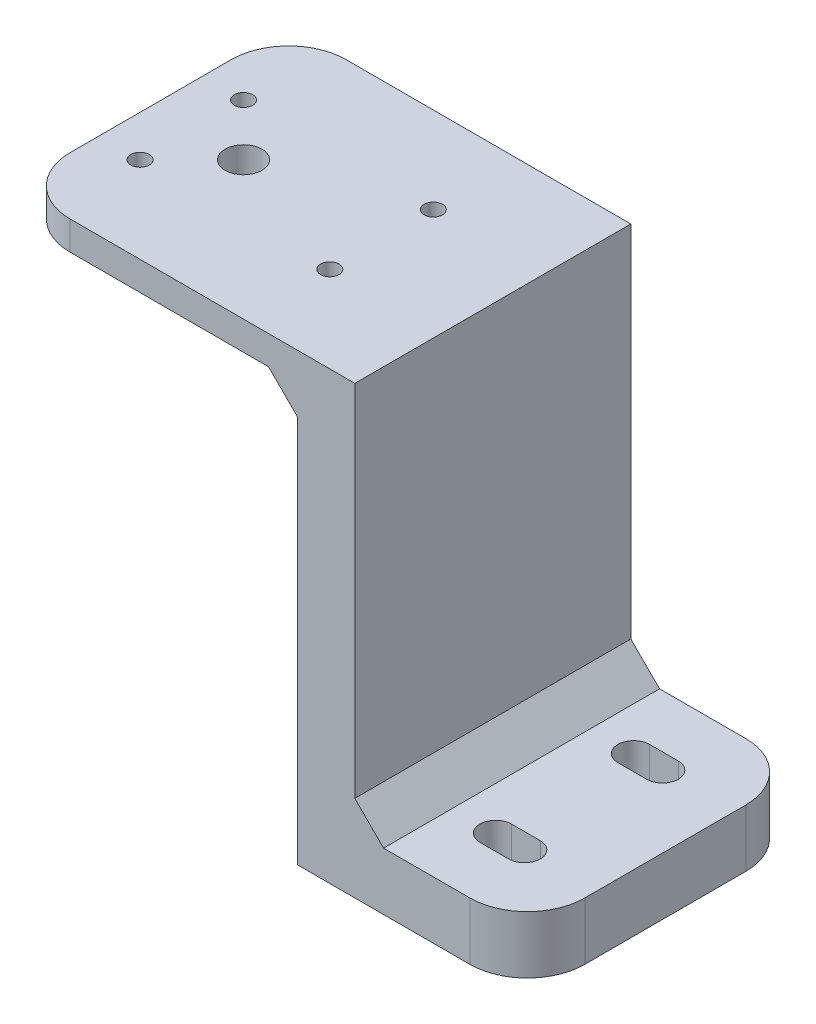
ISO-10303-21;
HEADER;
FILE_DESCRIPTION(('STEP AP214'),'2;1');
FILE_NAME('part.step','',(''),(''),'','','');
FILE_SCHEMA(('AUTOMOTIVE_DESIGN { 1 0 10303 214 1 1 1 1 }'));
ENDSEC;
DATA;
#1=APPLICATION_CONTEXT('core data for automotive mechanical design processes');
#2=APPLICATION_PROTOCOL_DEFINITION('international standard','automotive_design',2000,#1);
#3=PRODUCT_CONTEXT('',#1,'mechanical');
#4=PRODUCT('Part','Part','',(#3));
#5=PRODUCT_RELATED_PRODUCT_CATEGORY('part','',(#4));
#6=PRODUCT_DEFINITION_FORMATION('','',#4);
#7=PRODUCT_DEFINITION_CONTEXT('part definition',#1,'design');
#8=PRODUCT_DEFINITION('design','',#6,#7);
#9=PRODUCT_DEFINITION_SHAPE('','',#8);
#10=(LENGTH_UNIT() NAMED_UNIT(*) SI_UNIT(.MILLI.,.METRE.));
#11=(NAMED_UNIT(*) PLANE_ANGLE_UNIT() SI_UNIT($,.RADIAN.));
#12=(NAMED_UNIT(*) SI_UNIT($,.STERADIAN.) SOLID_ANGLE_UNIT());
#13=UNCERTAINTY_MEASURE_WITH_UNIT(LENGTH_MEASURE(1.E-05),#10,'distance_accuracy_value','');
#14=(GEOMETRIC_REPRESENTATION_CONTEXT(3) GLOBAL_UNCERTAINTY_ASSIGNED_CONTEXT((#13)) GLOBAL_UNIT_ASSIGNED_CONTEXT((#10,
#11,#12)) REPRESENTATION_CONTEXT('',''));
#15=CARTESIAN_POINT('',(0.,0.,0.));
#16=DIRECTION('',(0.,0.,1.));
#17=DIRECTION('',(1.,0.,0.));
#18=AXIS2_PLACEMENT_3D('',#15,#16,#17);
#19=CARTESIAN_POINT('',(35.5,5.,-24.));
#20=DIRECTION('',(-1.,0.,0.));
#21=DIRECTION('',(0.,0.,1.));
#22=AXIS2_PLACEMENT_3D('',#19,#20,#21);
#23=PLANE('',#22);
#24=DIRECTION('',(0.,-1.,0.));
#25=VECTOR('',#24,1.);
#26=CARTESIAN_POINT('',(35.5,5.,24.));
#27=LINE('',#26,#25);
#28=CARTESIAN_POINT('',(35.5,5.,24.));
#29=VERTEX_POINT('',#28);
#30=CARTESIAN_POINT('',(35.5,-57.5,24.));
#31=VERTEX_POINT('',#30);
#32=EDGE_CURVE('E496',#29,#31,#27,.T.);
#33=ORIENTED_EDGE('',*,*,#32,.T.);
#34=DIRECTION('',(0.,0.,-1.));
#35=VECTOR('',#34,1.);
#36=CARTESIAN_POINT('',(35.5,-57.5,-24.));
#37=LINE('',#36,#35);
#38=CARTESIAN_POINT('',(35.5,-57.5,-24.));
#39=VERTEX_POINT('',#38);
#40=EDGE_CURVE('E557',#31,#39,#37,.T.);
#41=ORIENTED_EDGE('',*,*,#40,.T.);
#42=DIRECTION('',(0.,-1.,0.));
#43=VECTOR('',#42,1.);
#44=CARTESIAN_POINT('',(35.5,5.,-24.));
#45=LINE('',#44,#43);
#46=CARTESIAN_POINT('',(35.5,5.,-24.));
#47=VERTEX_POINT('',#46);
#48=EDGE_CURVE('E484',#47,#39,#45,.T.);
#49=ORIENTED_EDGE('',*,*,#48,.F.);
#50=DIRECTION('',(0.,0.,-1.));
#51=VECTOR('',#50,1.);
#52=CARTESIAN_POINT('',(35.5,5.,-24.));
#53=LINE('',#52,#51);
#54=EDGE_CURVE('E477',#29,#47,#53,.T.);
#55=ORIENTED_EDGE('',*,*,#54,.F.);
#56=EDGE_LOOP('',(#33,#41,#49,#55));
#57=FACE_BOUND('',#56,.T.);
#58=ADVANCED_FACE('F194',(#57),#23,.F.);
#59=CARTESIAN_POINT('',(0.,0.,0.));
#60=DIRECTION('',(0.,1.,0.));
#61=DIRECTION('',(0.,0.,1.));
#62=AXIS2_PLACEMENT_3D('',#59,#60,#61);
#63=PLANE('',#62);
#64=CARTESIAN_POINT('',(-7.84999999999999,0.,0.));
#65=DIRECTION('',(0.,1.,0.));
#66=DIRECTION('',(0.,0.,1.));
#67=AXIS2_PLACEMENT_3D('',#64,#65,#66);
#68=CIRCLE('',#67,3.19999999999999);
#69=CARTESIAN_POINT('',(-7.84999999999999,0.,3.19999999999999));
#70=VERTEX_POINT('',#69);
#71=EDGE_CURVE('E778',#70,#70,#68,.T.);
#72=ORIENTED_EDGE('',*,*,#71,.T.);
#73=EDGE_LOOP('',(#72));
#74=FACE_BOUND('',#73,.T.);
#75=CARTESIAN_POINT('',(-16.85,0.,9.00000000000001));
#76=DIRECTION('',(0.,1.,0.));
#77=DIRECTION('',(0.,0.,1.));
#78=AXIS2_PLACEMENT_3D('',#75,#76,#77);
#79=CIRCLE('',#78,1.59999999999999);
#80=CARTESIAN_POINT('',(-16.85,0.,10.6));
#81=VERTEX_POINT('',#80);
#82=EDGE_CURVE('E783',#81,#81,#79,.T.);
#83=ORIENTED_EDGE('',*,*,#82,.T.);
#84=EDGE_LOOP('',(#83));
#85=FACE_BOUND('',#84,.T.);
#86=CARTESIAN_POINT('',(-16.85,0.,-8.99999999999999));
#87=DIRECTION('',(0.,1.,0.));
#88=DIRECTION('',(0.,0.,1.));
#89=AXIS2_PLACEMENT_3D('',#86,#87,#88);
#90=CIRCLE('',#89,1.59999999999999);
#91=CARTESIAN_POINT('',(-16.85,0.,-7.4));
#92=VERTEX_POINT('',#91);
#93=EDGE_CURVE('E792',#92,#92,#90,.T.);
#94=ORIENTED_EDGE('',*,*,#93,.T.);
#95=EDGE_LOOP('',(#94));
#96=FACE_BOUND('',#95,.T.);
#97=CARTESIAN_POINT('',(16.15,0.,-8.99999999999999));
#98=DIRECTION('',(0.,1.,0.));
#99=DIRECTION('',(0.,0.,1.));
#100=AXIS2_PLACEMENT_3D('',#97,#98,#99);
#101=CIRCLE('',#100,1.59999999999999);
#102=CARTESIAN_POINT('',(16.15,0.,-7.4));
#103=VERTEX_POINT('',#102);
#104=EDGE_CURVE('E712',#103,#103,#101,.T.);
#105=ORIENTED_EDGE('',*,*,#104,.T.);
#106=EDGE_LOOP('',(#105));
#107=FACE_BOUND('',#106,.T.);
#108=CARTESIAN_POINT('',(16.15,0.,9.00000000000001));
#109=DIRECTION('',(0.,1.,0.));
#110=DIRECTION('',(0.,0.,1.));
#111=AXIS2_PLACEMENT_3D('',#108,#109,#110);
#112=CIRCLE('',#111,1.59999999999999);
#113=CARTESIAN_POINT('',(16.15,0.,10.6));
#114=VERTEX_POINT('',#113);
#115=EDGE_CURVE('E711',#114,#114,#112,.T.);
#116=ORIENTED_EDGE('',*,*,#115,.T.);
#117=EDGE_LOOP('',(#116));
#118=FACE_BOUND('',#117,.T.);
#119=DIRECTION('',(-1.,0.,0.));
#120=VECTOR('',#119,1.);
#121=CARTESIAN_POINT('',(-24.,0.,-24.));
#122=LINE('',#121,#120);
#123=CARTESIAN_POINT('',(20.5,0.,-24.));
#124=VERTEX_POINT('',#123);
#125=CARTESIAN_POINT('',(-14.,0.,-24.));
#126=VERTEX_POINT('',#125);
#127=EDGE_CURVE('E474',#124,#126,#122,.T.);
#128=ORIENTED_EDGE('',*,*,#127,.F.);
#129=DIRECTION('',(0.,0.,1.));
#130=VECTOR('',#129,1.);
#131=CARTESIAN_POINT('',(20.5,0.,24.));
#132=LINE('',#131,#130);
#133=CARTESIAN_POINT('',(20.5,0.,24.));
#134=VERTEX_POINT('',#133);
#135=EDGE_CURVE('E211',#124,#134,#132,.T.);
#136=ORIENTED_EDGE('',*,*,#135,.T.);
#137=DIRECTION('',(1.,0.,0.));
#138=VECTOR('',#137,1.);
#139=CARTESIAN_POINT('',(-24.,0.,24.));
#140=LINE('',#139,#138);
#141=CARTESIAN_POINT('',(-14.,0.,24.));
#142=VERTEX_POINT('',#141);
#143=EDGE_CURVE('E488',#142,#134,#140,.T.);
#144=ORIENTED_EDGE('',*,*,#143,.F.);
#145=CARTESIAN_POINT('',(-14.,0.,14.));
#146=DIRECTION('',(0.,1.,0.));
#147=DIRECTION('',(0.,0.,1.));
#148=AXIS2_PLACEMENT_3D('',#145,#146,#147);
#149=CIRCLE('',#148,10.);
#150=CARTESIAN_POINT('',(-24.,0.,14.));
#151=VERTEX_POINT('',#150);
#152=EDGE_CURVE('E507',#142,#151,#149,.F.);
#153=ORIENTED_EDGE('',*,*,#152,.T.);
#154=DIRECTION('',(0.,0.,1.));
#155=VECTOR('',#154,1.);
#156=CARTESIAN_POINT('',(-24.,0.,-24.));
#157=LINE('',#156,#155);
#158=CARTESIAN_POINT('',(-24.,0.,-14.));
#159=VERTEX_POINT('',#158);
#160=EDGE_CURVE('E468',#159,#151,#157,.T.);
#161=ORIENTED_EDGE('',*,*,#160,.F.);
#162=CARTESIAN_POINT('',(-14.,0.,-14.));
#163=DIRECTION('',(0.,1.,0.));
#164=DIRECTION('',(0.,0.,1.));
#165=AXIS2_PLACEMENT_3D('',#162,#163,#164);
#166=CIRCLE('',#165,10.);
#167=EDGE_CURVE('E510',#159,#126,#166,.F.);
#168=ORIENTED_EDGE('',*,*,#167,.T.);
#169=EDGE_LOOP('',(#128,#136,#144,#153,#161,#168));
#170=FACE_BOUND('',#169,.T.);
#171=ADVANCED_FACE('F601',(#74,#85,#96,#107,#118,#170),#63,.F.);
#172=CARTESIAN_POINT('',(-24.,5.,-24.));
#173=DIRECTION('',(1.,0.,0.));
#174=DIRECTION('',(0.,0.,-1.));
#175=AXIS2_PLACEMENT_3D('',#172,#173,#174);
#176=PLANE('',#175);
#177=DIRECTION('',(0.,0.,1.));
#178=VECTOR('',#177,1.);
#179=CARTESIAN_POINT('',(-24.,5.,-24.));
#180=LINE('',#179,#178);
#181=CARTESIAN_POINT('',(-24.,5.,-14.));
#182=VERTEX_POINT('',#181);
#183=CARTESIAN_POINT('',(-24.,5.,14.));
#184=VERTEX_POINT('',#183);
#185=EDGE_CURVE('E469',#182,#184,#180,.T.);
#186=ORIENTED_EDGE('',*,*,#185,.F.);
#187=DIRECTION('',(0.,-1.,0.));
#188=VECTOR('',#187,1.);
#189=CARTESIAN_POINT('',(-24.,5.,-14.));
#190=LINE('',#189,#188);
#191=EDGE_CURVE('E503',#182,#159,#190,.T.);
#192=ORIENTED_EDGE('',*,*,#191,.T.);
#193=ORIENTED_EDGE('',*,*,#160,.T.);
#194=DIRECTION('',(0.,-1.,0.));
#195=VECTOR('',#194,1.);
#196=CARTESIAN_POINT('',(-24.,5.,14.));
#197=LINE('',#196,#195);
#198=EDGE_CURVE('E500',#151,#184,#197,.F.);
#199=ORIENTED_EDGE('',*,*,#198,.T.);
#200=EDGE_LOOP('',(#186,#192,#193,#199));
#201=FACE_BOUND('',#200,.T.);
#202=ADVANCED_FACE('F604',(#201),#176,.F.);
#203=CARTESIAN_POINT('',(-24.,5.,24.));
#204=DIRECTION('',(0.,0.,-1.));
#205=DIRECTION('',(-1.,0.,0.));
#206=AXIS2_PLACEMENT_3D('',#203,#204,#205);
#207=PLANE('',#206);
#208=DIRECTION('',(-1.,0.,0.));
#209=VECTOR('',#208,1.);
#210=CARTESIAN_POINT('',(35.5,-72.5,24.));
#211=LINE('',#210,#209);
#212=CARTESIAN_POINT('',(55.5,-72.5,24.));
#213=VERTEX_POINT('',#212);
#214=CARTESIAN_POINT('',(25.5,-72.5,24.));
#215=VERTEX_POINT('',#214);
#216=EDGE_CURVE('E451',#213,#215,#211,.T.);
#217=ORIENTED_EDGE('',*,*,#216,.F.);
#218=DIRECTION('',(0.,-1.,0.));
#219=VECTOR('',#218,1.);
#220=CARTESIAN_POINT('',(55.5,5.,24.));
#221=LINE('',#220,#219);
#222=CARTESIAN_POINT('',(55.5,-62.5,24.));
#223=VERTEX_POINT('',#222);
#224=EDGE_CURVE('E550',#213,#223,#221,.F.);
#225=ORIENTED_EDGE('',*,*,#224,.T.);
#226=DIRECTION('',(-1.,0.,0.));
#227=VECTOR('',#226,1.);
#228=CARTESIAN_POINT('',(65.5,-62.5,24.));
#229=LINE('',#228,#227);
#230=CARTESIAN_POINT('',(40.5000000000001,-62.5,24.));
#231=VERTEX_POINT('',#230);
#232=EDGE_CURVE('E443',#223,#231,#229,.T.);
#233=ORIENTED_EDGE('',*,*,#232,.T.);
#234=DIRECTION('',(0.707106781186552,-0.707106781186543,0.));
#235=VECTOR('',#234,1.);
#236=CARTESIAN_POINT('',(-25.5000000000004,3.49999999999958,24.));
#237=LINE('',#236,#235);
#238=EDGE_CURVE('E566',#231,#31,#237,.F.);
#239=ORIENTED_EDGE('',*,*,#238,.T.);
#240=ORIENTED_EDGE('',*,*,#32,.F.);
#241=DIRECTION('',(1.,0.,0.));
#242=VECTOR('',#241,1.);
#243=CARTESIAN_POINT('',(-24.,5.,24.));
#244=LINE('',#243,#242);
#245=CARTESIAN_POINT('',(-14.,5.,24.));
#246=VERTEX_POINT('',#245);
#247=EDGE_CURVE('E473',#246,#29,#244,.T.);
#248=ORIENTED_EDGE('',*,*,#247,.F.);
#249=DIRECTION('',(0.,-1.,0.));
#250=VECTOR('',#249,1.);
#251=CARTESIAN_POINT('',(-14.,5.,24.));
#252=LINE('',#251,#250);
#253=EDGE_CURVE('E523',#246,#142,#252,.T.);
#254=ORIENTED_EDGE('',*,*,#253,.T.);
#255=ORIENTED_EDGE('',*,*,#143,.T.);
#256=DIRECTION('',(-0.707106781186544,0.707106781186551,0.));
#257=VECTOR('',#256,1.);
#258=CARTESIAN_POINT('',(-4.24999999999976,24.75,24.));
#259=LINE('',#258,#257);
#260=CARTESIAN_POINT('',(25.5,-5.00000000000007,24.));
#261=VERTEX_POINT('',#260);
#262=EDGE_CURVE('E13',#134,#261,#259,.F.);
#263=ORIENTED_EDGE('',*,*,#262,.T.);
#264=DIRECTION('',(0.,1.,0.));
#265=VECTOR('',#264,1.);
#266=CARTESIAN_POINT('',(25.5,-72.5,24.));
#267=LINE('',#266,#265);
#268=EDGE_CURVE('E464',#215,#261,#267,.T.);
#269=ORIENTED_EDGE('',*,*,#268,.F.);
#270=EDGE_LOOP('',(#217,#225,#233,#239,#240,#248,#254,#255,#263,#269));
#271=FACE_BOUND('',#270,.T.);
#272=ADVANCED_FACE('F588',(#271),#207,.F.);
#273=CARTESIAN_POINT('',(-24.,5.,-24.));
#274=DIRECTION('',(0.,0.,1.));
#275=DIRECTION('',(1.,0.,0.));
#276=AXIS2_PLACEMENT_3D('',#273,#274,#275);
#277=PLANE('',#276);
#278=DIRECTION('',(-1.,0.,0.));
#279=VECTOR('',#278,1.);
#280=CARTESIAN_POINT('',(65.5,-62.5,-24.));
#281=LINE('',#280,#279);
#282=CARTESIAN_POINT('',(55.5,-62.5,-24.));
#283=VERTEX_POINT('',#282);
#284=CARTESIAN_POINT('',(40.5000000000001,-62.5,-24.));
#285=VERTEX_POINT('',#284);
#286=EDGE_CURVE('E447',#283,#285,#281,.T.);
#287=ORIENTED_EDGE('',*,*,#286,.F.);
#288=DIRECTION('',(0.,1.,0.));
#289=VECTOR('',#288,1.);
#290=CARTESIAN_POINT('',(55.5,5.,-24.));
#291=LINE('',#290,#289);
#292=CARTESIAN_POINT('',(55.5,-72.5,-24.));
#293=VERTEX_POINT('',#292);
#294=EDGE_CURVE('E541',#283,#293,#291,.F.);
#295=ORIENTED_EDGE('',*,*,#294,.T.);
#296=DIRECTION('',(1.,0.,0.));
#297=VECTOR('',#296,1.);
#298=CARTESIAN_POINT('',(35.5,-72.5,-24.));
#299=LINE('',#298,#297);
#300=CARTESIAN_POINT('',(25.5,-72.5,-24.));
#301=VERTEX_POINT('',#300);
#302=EDGE_CURVE('E457',#301,#293,#299,.T.);
#303=ORIENTED_EDGE('',*,*,#302,.F.);
#304=DIRECTION('',(0.,1.,0.));
#305=VECTOR('',#304,1.);
#306=CARTESIAN_POINT('',(25.5,-72.5,-24.));
#307=LINE('',#306,#305);
#308=CARTESIAN_POINT('',(25.5,-5.00000000000007,-24.));
#309=VERTEX_POINT('',#308);
#310=EDGE_CURVE('E461',#301,#309,#307,.T.);
#311=ORIENTED_EDGE('',*,*,#310,.T.);
#312=DIRECTION('',(0.707106781186544,-0.707106781186551,0.));
#313=VECTOR('',#312,1.);
#314=CARTESIAN_POINT('',(-4.24999999999976,24.75,-24.));
#315=LINE('',#314,#313);
#316=EDGE_CURVE('E204',#309,#124,#315,.F.);
#317=ORIENTED_EDGE('',*,*,#316,.T.);
#318=ORIENTED_EDGE('',*,*,#127,.T.);
#319=DIRECTION('',(0.,-1.,0.));
#320=VECTOR('',#319,1.);
#321=CARTESIAN_POINT('',(-14.,5.,-24.));
#322=LINE('',#321,#320);
#323=CARTESIAN_POINT('',(-14.,5.,-24.));
#324=VERTEX_POINT('',#323);
#325=EDGE_CURVE('E514',#126,#324,#322,.F.);
#326=ORIENTED_EDGE('',*,*,#325,.T.);
#327=DIRECTION('',(-1.,0.,0.));
#328=VECTOR('',#327,1.);
#329=CARTESIAN_POINT('',(-24.,5.,-24.));
#330=LINE('',#329,#328);
#331=EDGE_CURVE('E480',#47,#324,#330,.T.);
#332=ORIENTED_EDGE('',*,*,#331,.F.);
#333=ORIENTED_EDGE('',*,*,#48,.T.);
#334=DIRECTION('',(-0.707106781186552,0.707106781186543,0.));
#335=VECTOR('',#334,1.);
#336=CARTESIAN_POINT('',(-25.5000000000004,3.49999999999957,-24.));
#337=LINE('',#336,#335);
#338=EDGE_CURVE('E569',#39,#285,#337,.F.);
#339=ORIENTED_EDGE('',*,*,#338,.T.);
#340=EDGE_LOOP('',(#287,#295,#303,#311,#317,#318,#326,#332,#333,#339));
#341=FACE_BOUND('',#340,.T.);
#342=ADVANCED_FACE('F574',(#341),#277,.F.);
#343=CARTESIAN_POINT('',(0.,5.,0.));
#344=DIRECTION('',(0.,1.,0.));
#345=DIRECTION('',(0.,0.,1.));
#346=AXIS2_PLACEMENT_3D('',#343,#344,#345);
#347=PLANE('',#346);
#348=CARTESIAN_POINT('',(-7.84999999999999,5.,0.));
#349=DIRECTION('',(0.,1.,0.));
#350=DIRECTION('',(0.,0.,1.));
#351=AXIS2_PLACEMENT_3D('',#348,#349,#350);
#352=CIRCLE('',#351,3.2);
#353=CARTESIAN_POINT('',(-7.84999999999999,5.,3.2));
#354=VERTEX_POINT('',#353);
#355=EDGE_CURVE('E693',#354,#354,#352,.T.);
#356=ORIENTED_EDGE('',*,*,#355,.F.);
#357=EDGE_LOOP('',(#356));
#358=FACE_BOUND('',#357,.T.);
#359=CARTESIAN_POINT('',(-16.85,5.,9.00000000000001));
#360=DIRECTION('',(0.,1.,0.));
#361=DIRECTION('',(0.,0.,1.));
#362=AXIS2_PLACEMENT_3D('',#359,#360,#361);
#363=CIRCLE('',#362,1.6);
#364=CARTESIAN_POINT('',(-16.85,5.,10.6));
#365=VERTEX_POINT('',#364);
#366=EDGE_CURVE('E697',#365,#365,#363,.T.);
#367=ORIENTED_EDGE('',*,*,#366,.F.);
#368=EDGE_LOOP('',(#367));
#369=FACE_BOUND('',#368,.T.);
#370=CARTESIAN_POINT('',(-16.85,5.,-8.99999999999999));
#371=DIRECTION('',(0.,1.,0.));
#372=DIRECTION('',(0.,0.,1.));
#373=AXIS2_PLACEMENT_3D('',#370,#371,#372);
#374=CIRCLE('',#373,1.6);
#375=CARTESIAN_POINT('',(-16.85,5.,-7.4));
#376=VERTEX_POINT('',#375);
#377=EDGE_CURVE('E701',#376,#376,#374,.T.);
#378=ORIENTED_EDGE('',*,*,#377,.F.);
#379=EDGE_LOOP('',(#378));
#380=FACE_BOUND('',#379,.T.);
#381=CARTESIAN_POINT('',(16.15,5.,-8.99999999999999));
#382=DIRECTION('',(0.,1.,0.));
#383=DIRECTION('',(0.,0.,1.));
#384=AXIS2_PLACEMENT_3D('',#381,#382,#383);
#385=CIRCLE('',#384,1.6);
#386=CARTESIAN_POINT('',(16.15,5.,-7.4));
#387=VERTEX_POINT('',#386);
#388=EDGE_CURVE('E705',#387,#387,#385,.T.);
#389=ORIENTED_EDGE('',*,*,#388,.F.);
#390=EDGE_LOOP('',(#389));
#391=FACE_BOUND('',#390,.T.);
#392=CARTESIAN_POINT('',(16.15,5.,9.00000000000001));
#393=DIRECTION('',(0.,1.,0.));
#394=DIRECTION('',(0.,0.,1.));
#395=AXIS2_PLACEMENT_3D('',#392,#393,#394);
#396=CIRCLE('',#395,1.6);
#397=CARTESIAN_POINT('',(16.15,5.,10.6));
#398=VERTEX_POINT('',#397);
#399=EDGE_CURVE('E708',#398,#398,#396,.T.);
#400=ORIENTED_EDGE('',*,*,#399,.F.);
#401=EDGE_LOOP('',(#400));
#402=FACE_BOUND('',#401,.T.);
#403=ORIENTED_EDGE('',*,*,#331,.T.);
#404=CARTESIAN_POINT('',(-14.,5.,-14.));
#405=DIRECTION('',(0.,1.,0.));
#406=DIRECTION('',(0.,0.,1.));
#407=AXIS2_PLACEMENT_3D('',#404,#405,#406);
#408=CIRCLE('',#407,10.);
#409=EDGE_CURVE('E520',#324,#182,#408,.T.);
#410=ORIENTED_EDGE('',*,*,#409,.T.);
#411=ORIENTED_EDGE('',*,*,#185,.T.);
#412=CARTESIAN_POINT('',(-14.,5.,14.));
#413=DIRECTION('',(0.,1.,0.));
#414=DIRECTION('',(0.,0.,1.));
#415=AXIS2_PLACEMENT_3D('',#412,#413,#414);
#416=CIRCLE('',#415,10.);
#417=EDGE_CURVE('E517',#184,#246,#416,.T.);
#418=ORIENTED_EDGE('',*,*,#417,.T.);
#419=ORIENTED_EDGE('',*,*,#247,.T.);
#420=ORIENTED_EDGE('',*,*,#54,.T.);
#421=EDGE_LOOP('',(#403,#410,#411,#418,#419,#420));
#422=FACE_BOUND('',#421,.T.);
#423=ADVANCED_FACE('F593',(#358,#369,#380,#391,#402,#422),#347,.T.);
#424=CARTESIAN_POINT('',(25.5,-72.5,24.));
#425=DIRECTION('',(1.,0.,0.));
#426=DIRECTION('',(0.,0.,-1.));
#427=AXIS2_PLACEMENT_3D('',#424,#425,#426);
#428=PLANE('',#427);
#429=ORIENTED_EDGE('',*,*,#268,.T.);
#430=DIRECTION('',(0.,0.,-1.));
#431=VECTOR('',#430,1.);
#432=CARTESIAN_POINT('',(25.5,-5.00000000000007,-24.));
#433=LINE('',#432,#431);
#434=EDGE_CURVE('E560',#261,#309,#433,.T.);
#435=ORIENTED_EDGE('',*,*,#434,.T.);
#436=ORIENTED_EDGE('',*,*,#310,.F.);
#437=DIRECTION('',(0.,0.,-1.));
#438=VECTOR('',#437,1.);
#439=CARTESIAN_POINT('',(25.5,-72.5,24.));
#440=LINE('',#439,#438);
#441=EDGE_CURVE('E454',#215,#301,#440,.T.);
#442=ORIENTED_EDGE('',*,*,#441,.F.);
#443=EDGE_LOOP('',(#429,#435,#436,#442));
#444=FACE_BOUND('',#443,.T.);
#445=ADVANCED_FACE('F615',(#444),#428,.F.);
#446=CARTESIAN_POINT('',(0.,-72.5,0.));
#447=DIRECTION('',(0.,1.,0.));
#448=DIRECTION('',(0.,0.,1.));
#449=AXIS2_PLACEMENT_3D('',#446,#447,#448);
#450=PLANE('',#449);
#451=CARTESIAN_POINT('',(48.,-72.5,12.));
#452=DIRECTION('',(0.,1.,0.));
#453=DIRECTION('',(0.,0.,1.));
#454=AXIS2_PLACEMENT_3D('',#451,#452,#453);
#455=CIRCLE('',#454,2.75);
#456=CARTESIAN_POINT('',(48.,-72.5,9.24999999999999));
#457=VERTEX_POINT('',#456);
#458=CARTESIAN_POINT('',(48.,-72.5,14.75));
#459=VERTEX_POINT('',#458);
#460=EDGE_CURVE('E383',#457,#459,#455,.T.);
#461=ORIENTED_EDGE('',*,*,#460,.T.);
#462=DIRECTION('',(-1.,0.,0.));
#463=VECTOR('',#462,1.);
#464=CARTESIAN_POINT('',(53.,-72.5,14.75));
#465=LINE('',#464,#463);
#466=CARTESIAN_POINT('',(53.,-72.5,14.75));
#467=VERTEX_POINT('',#466);
#468=EDGE_CURVE('E356',#467,#459,#465,.T.);
#469=ORIENTED_EDGE('',*,*,#468,.F.);
#470=CARTESIAN_POINT('',(53.,-72.5,12.));
#471=DIRECTION('',(0.,1.,0.));
#472=DIRECTION('',(0.,0.,1.));
#473=AXIS2_PLACEMENT_3D('',#470,#471,#472);
#474=CIRCLE('',#473,2.75);
#475=CARTESIAN_POINT('',(53.,-72.5,9.24999999999998));
#476=VERTEX_POINT('',#475);
#477=EDGE_CURVE('E363',#467,#476,#474,.T.);
#478=ORIENTED_EDGE('',*,*,#477,.T.);
#479=DIRECTION('',(-1.,0.,0.));
#480=VECTOR('',#479,1.);
#481=CARTESIAN_POINT('',(53.,-72.5,9.24999999999999));
#482=LINE('',#481,#480);
#483=EDGE_CURVE('E724',#476,#457,#482,.T.);
#484=ORIENTED_EDGE('',*,*,#483,.T.);
#485=EDGE_LOOP('',(#461,#469,#478,#484));
#486=FACE_BOUND('',#485,.T.);
#487=DIRECTION('',(-1.,0.,0.));
#488=VECTOR('',#487,1.);
#489=CARTESIAN_POINT('',(53.,-72.5,-14.75));
#490=LINE('',#489,#488);
#491=CARTESIAN_POINT('',(53.,-72.5,-14.75));
#492=VERTEX_POINT('',#491);
#493=CARTESIAN_POINT('',(48.,-72.5,-14.75));
#494=VERTEX_POINT('',#493);
#495=EDGE_CURVE('E395',#492,#494,#490,.T.);
#496=ORIENTED_EDGE('',*,*,#495,.T.);
#497=CARTESIAN_POINT('',(48.,-72.5,-12.));
#498=DIRECTION('',(0.,1.,0.));
#499=DIRECTION('',(0.,0.,1.));
#500=AXIS2_PLACEMENT_3D('',#497,#498,#499);
#501=CIRCLE('',#500,2.75);
#502=CARTESIAN_POINT('',(48.,-72.5,-9.25));
#503=VERTEX_POINT('',#502);
#504=EDGE_CURVE('E424',#494,#503,#501,.T.);
#505=ORIENTED_EDGE('',*,*,#504,.T.);
#506=DIRECTION('',(-1.,0.,0.));
#507=VECTOR('',#506,1.);
#508=CARTESIAN_POINT('',(53.,-72.5,-9.25000000000001));
#509=LINE('',#508,#507);
#510=CARTESIAN_POINT('',(53.,-72.5,-9.25000000000001));
#511=VERTEX_POINT('',#510);
#512=EDGE_CURVE('E399',#511,#503,#509,.T.);
#513=ORIENTED_EDGE('',*,*,#512,.F.);
#514=CARTESIAN_POINT('',(53.,-72.5,-12.));
#515=DIRECTION('',(0.,1.,0.));
#516=DIRECTION('',(0.,0.,1.));
#517=AXIS2_PLACEMENT_3D('',#514,#515,#516);
#518=CIRCLE('',#517,2.75);
#519=EDGE_CURVE('E409',#511,#492,#518,.T.);
#520=ORIENTED_EDGE('',*,*,#519,.T.);
#521=EDGE_LOOP('',(#496,#505,#513,#520));
#522=FACE_BOUND('',#521,.T.);
#523=ORIENTED_EDGE('',*,*,#302,.T.);
#524=CARTESIAN_POINT('',(55.5,-72.5,-14.));
#525=DIRECTION('',(0.,1.,0.));
#526=DIRECTION('',(0.,0.,1.));
#527=AXIS2_PLACEMENT_3D('',#524,#525,#526);
#528=CIRCLE('',#527,10.);
#529=CARTESIAN_POINT('',(65.5,-72.5,-14.));
#530=VERTEX_POINT('',#529);
#531=EDGE_CURVE('E547',#293,#530,#528,.F.);
#532=ORIENTED_EDGE('',*,*,#531,.T.);
#533=DIRECTION('',(0.,0.,-1.));
#534=VECTOR('',#533,1.);
#535=CARTESIAN_POINT('',(65.5,-72.5,24.));
#536=LINE('',#535,#534);
#537=CARTESIAN_POINT('',(65.5,-72.5,14.));
#538=VERTEX_POINT('',#537);
#539=EDGE_CURVE('E435',#538,#530,#536,.T.);
#540=ORIENTED_EDGE('',*,*,#539,.F.);
#541=CARTESIAN_POINT('',(55.5,-72.5,14.));
#542=DIRECTION('',(0.,1.,0.));
#543=DIRECTION('',(0.,0.,1.));
#544=AXIS2_PLACEMENT_3D('',#541,#542,#543);
#545=CIRCLE('',#544,10.);
#546=EDGE_CURVE('E544',#538,#213,#545,.F.);
#547=ORIENTED_EDGE('',*,*,#546,.T.);
#548=ORIENTED_EDGE('',*,*,#216,.T.);
#549=ORIENTED_EDGE('',*,*,#441,.T.);
#550=EDGE_LOOP('',(#523,#532,#540,#547,#548,#549));
#551=FACE_BOUND('',#550,.T.);
#552=ADVANCED_FACE('F619',(#486,#522,#551),#450,.F.);
#553=CARTESIAN_POINT('',(65.5,-62.5,24.));
#554=DIRECTION('',(0.,-1.,0.));
#555=DIRECTION('',(0.,0.,-1.));
#556=AXIS2_PLACEMENT_3D('',#553,#554,#555);
#557=PLANE('',#556);
#558=CARTESIAN_POINT('',(53.,-62.5,12.));
#559=DIRECTION('',(0.,1.,0.));
#560=DIRECTION('',(0.,0.,1.));
#561=AXIS2_PLACEMENT_3D('',#558,#559,#560);
#562=CIRCLE('',#561,2.75);
#563=CARTESIAN_POINT('',(53.,-62.5,14.75));
#564=VERTEX_POINT('',#563);
#565=CARTESIAN_POINT('',(53.,-62.5,9.25000000000002));
#566=VERTEX_POINT('',#565);
#567=EDGE_CURVE('E355',#564,#566,#562,.T.);
#568=ORIENTED_EDGE('',*,*,#567,.F.);
#569=DIRECTION('',(-1.,0.,0.));
#570=VECTOR('',#569,1.);
#571=CARTESIAN_POINT('',(53.,-62.5,14.75));
#572=LINE('',#571,#570);
#573=CARTESIAN_POINT('',(48.,-62.5,14.75));
#574=VERTEX_POINT('',#573);
#575=EDGE_CURVE('E343',#564,#574,#572,.T.);
#576=ORIENTED_EDGE('',*,*,#575,.T.);
#577=CARTESIAN_POINT('',(48.,-62.5,12.));
#578=DIRECTION('',(0.,1.,0.));
#579=DIRECTION('',(0.,0.,1.));
#580=AXIS2_PLACEMENT_3D('',#577,#578,#579);
#581=CIRCLE('',#580,2.75);
#582=CARTESIAN_POINT('',(48.,-62.5,9.25000000000002));
#583=VERTEX_POINT('',#582);
#584=EDGE_CURVE('E366',#583,#574,#581,.T.);
#585=ORIENTED_EDGE('',*,*,#584,.F.);
#586=DIRECTION('',(-1.,0.,0.));
#587=VECTOR('',#586,1.);
#588=CARTESIAN_POINT('',(53.,-62.5,9.25000000000002));
#589=LINE('',#588,#587);
#590=EDGE_CURVE('E372',#566,#583,#589,.T.);
#591=ORIENTED_EDGE('',*,*,#590,.F.);
#592=EDGE_LOOP('',(#568,#576,#585,#591));
#593=FACE_BOUND('',#592,.T.);
#594=CARTESIAN_POINT('',(53.,-62.5,-12.));
#595=DIRECTION('',(0.,1.,0.));
#596=DIRECTION('',(0.,0.,1.));
#597=AXIS2_PLACEMENT_3D('',#594,#595,#596);
#598=CIRCLE('',#597,2.75);
#599=CARTESIAN_POINT('',(53.,-62.5,-9.25));
#600=VERTEX_POINT('',#599);
#601=CARTESIAN_POINT('',(53.,-62.5,-14.75));
#602=VERTEX_POINT('',#601);
#603=EDGE_CURVE('E406',#600,#602,#598,.T.);
#604=ORIENTED_EDGE('',*,*,#603,.F.);
#605=DIRECTION('',(-1.,0.,0.));
#606=VECTOR('',#605,1.);
#607=CARTESIAN_POINT('',(53.,-62.5,-9.25));
#608=LINE('',#607,#606);
#609=CARTESIAN_POINT('',(48.,-62.5,-9.24999999999999));
#610=VERTEX_POINT('',#609);
#611=EDGE_CURVE('E402',#600,#610,#608,.T.);
#612=ORIENTED_EDGE('',*,*,#611,.T.);
#613=CARTESIAN_POINT('',(48.,-62.5,-12.));
#614=DIRECTION('',(0.,1.,0.));
#615=DIRECTION('',(0.,0.,1.));
#616=AXIS2_PLACEMENT_3D('',#613,#614,#615);
#617=CIRCLE('',#616,2.75);
#618=CARTESIAN_POINT('',(48.,-62.5,-14.75));
#619=VERTEX_POINT('',#618);
#620=EDGE_CURVE('E420',#619,#610,#617,.T.);
#621=ORIENTED_EDGE('',*,*,#620,.F.);
#622=DIRECTION('',(-1.,0.,0.));
#623=VECTOR('',#622,1.);
#624=CARTESIAN_POINT('',(53.,-62.5,-14.75));
#625=LINE('',#624,#623);
#626=EDGE_CURVE('E392',#602,#619,#625,.T.);
#627=ORIENTED_EDGE('',*,*,#626,.F.);
#628=EDGE_LOOP('',(#604,#612,#621,#627));
#629=FACE_BOUND('',#628,.T.);
#630=ORIENTED_EDGE('',*,*,#286,.T.);
#631=DIRECTION('',(0.,0.,1.));
#632=VECTOR('',#631,1.);
#633=CARTESIAN_POINT('',(40.5000000000001,-62.5,24.));
#634=LINE('',#633,#632);
#635=EDGE_CURVE('E553',#285,#231,#634,.T.);
#636=ORIENTED_EDGE('',*,*,#635,.T.);
#637=ORIENTED_EDGE('',*,*,#232,.F.);
#638=CARTESIAN_POINT('',(55.5,-62.5,14.));
#639=DIRECTION('',(0.,-1.,0.));
#640=DIRECTION('',(0.,0.,-1.));
#641=AXIS2_PLACEMENT_3D('',#638,#639,#640);
#642=CIRCLE('',#641,10.);
#643=CARTESIAN_POINT('',(65.5,-62.5,14.));
#644=VERTEX_POINT('',#643);
#645=EDGE_CURVE('E535',#223,#644,#642,.F.);
#646=ORIENTED_EDGE('',*,*,#645,.T.);
#647=DIRECTION('',(0.,0.,1.));
#648=VECTOR('',#647,1.);
#649=CARTESIAN_POINT('',(65.5,-62.5,24.));
#650=LINE('',#649,#648);
#651=CARTESIAN_POINT('',(65.5,-62.5,-14.));
#652=VERTEX_POINT('',#651);
#653=EDGE_CURVE('E439',#652,#644,#650,.T.);
#654=ORIENTED_EDGE('',*,*,#653,.F.);
#655=CARTESIAN_POINT('',(55.5,-62.5,-14.));
#656=DIRECTION('',(0.,-1.,0.));
#657=DIRECTION('',(0.,0.,-1.));
#658=AXIS2_PLACEMENT_3D('',#655,#656,#657);
#659=CIRCLE('',#658,10.);
#660=EDGE_CURVE('E538',#652,#283,#659,.F.);
#661=ORIENTED_EDGE('',*,*,#660,.T.);
#662=EDGE_LOOP('',(#630,#636,#637,#646,#654,#661));
#663=FACE_BOUND('',#662,.T.);
#664=ADVANCED_FACE('F369',(#593,#629,#663),#557,.F.);
#665=CARTESIAN_POINT('',(65.5,0.,0.));
#666=DIRECTION('',(-1.,0.,0.));
#667=DIRECTION('',(0.,0.,1.));
#668=AXIS2_PLACEMENT_3D('',#665,#666,#667);
#669=PLANE('',#668);
#670=ORIENTED_EDGE('',*,*,#539,.T.);
#671=DIRECTION('',(0.,1.,0.));
#672=VECTOR('',#671,1.);
#673=CARTESIAN_POINT('',(65.5,0.,-14.));
#674=LINE('',#673,#672);
#675=EDGE_CURVE('E531',#530,#652,#674,.T.);
#676=ORIENTED_EDGE('',*,*,#675,.T.);
#677=ORIENTED_EDGE('',*,*,#653,.T.);
#678=DIRECTION('',(0.,-1.,0.));
#679=VECTOR('',#678,1.);
#680=CARTESIAN_POINT('',(65.5,0.,14.));
#681=LINE('',#680,#679);
#682=EDGE_CURVE('E527',#644,#538,#681,.T.);
#683=ORIENTED_EDGE('',*,*,#682,.T.);
#684=EDGE_LOOP('',(#670,#676,#677,#683));
#685=FACE_BOUND('',#684,.T.);
#686=ADVANCED_FACE('F628',(#685),#669,.F.);
#687=CARTESIAN_POINT('',(-14.,5.,-14.));
#688=DIRECTION('',(0.,-1.,0.));
#689=DIRECTION('',(0.,0.,-1.));
#690=AXIS2_PLACEMENT_3D('',#687,#688,#689);
#691=CYLINDRICAL_SURFACE('',#690,10.);
#692=ORIENTED_EDGE('',*,*,#409,.F.);
#693=ORIENTED_EDGE('',*,*,#325,.F.);
#694=ORIENTED_EDGE('',*,*,#167,.F.);
#695=ORIENTED_EDGE('',*,*,#191,.F.);
#696=EDGE_LOOP('',(#692,#693,#694,#695));
#697=FACE_BOUND('',#696,.T.);
#698=ADVANCED_FACE('F607',(#697),#691,.T.);
#699=CARTESIAN_POINT('',(-14.,5.,14.));
#700=DIRECTION('',(0.,-1.,0.));
#701=DIRECTION('',(0.,0.,-1.));
#702=AXIS2_PLACEMENT_3D('',#699,#700,#701);
#703=CYLINDRICAL_SURFACE('',#702,10.);
#704=ORIENTED_EDGE('',*,*,#417,.F.);
#705=ORIENTED_EDGE('',*,*,#198,.F.);
#706=ORIENTED_EDGE('',*,*,#152,.F.);
#707=ORIENTED_EDGE('',*,*,#253,.F.);
#708=EDGE_LOOP('',(#704,#705,#706,#707));
#709=FACE_BOUND('',#708,.T.);
#710=ADVANCED_FACE('F598',(#709),#703,.T.);
#711=CARTESIAN_POINT('',(48.,-62.5,-12.));
#712=DIRECTION('',(0.,1.,0.));
#713=DIRECTION('',(0.,0.,1.));
#714=AXIS2_PLACEMENT_3D('',#711,#712,#713);
#715=CYLINDRICAL_SURFACE('',#714,2.75);
#716=ORIENTED_EDGE('',*,*,#620,.T.);
#717=DIRECTION('',(0.,1.,0.));
#718=VECTOR('',#717,1.);
#719=CARTESIAN_POINT('',(48.,-62.5,-9.25));
#720=LINE('',#719,#718);
#721=EDGE_CURVE('E428',#503,#610,#720,.T.);
#722=ORIENTED_EDGE('',*,*,#721,.F.);
#723=ORIENTED_EDGE('',*,*,#504,.F.);
#724=DIRECTION('',(0.,1.,0.));
#725=VECTOR('',#724,1.);
#726=CARTESIAN_POINT('',(48.,-62.5,-14.75));
#727=LINE('',#726,#725);
#728=EDGE_CURVE('E431',#619,#494,#727,.F.);
#729=ORIENTED_EDGE('',*,*,#728,.F.);
#730=EDGE_LOOP('',(#716,#722,#723,#729));
#731=FACE_BOUND('',#730,.T.);
#732=ADVANCED_FACE('F661',(#731),#715,.F.);
#733=CARTESIAN_POINT('',(53.,-62.5,-12.));
#734=DIRECTION('',(0.,1.,0.));
#735=DIRECTION('',(0.,0.,1.));
#736=AXIS2_PLACEMENT_3D('',#733,#734,#735);
#737=CYLINDRICAL_SURFACE('',#736,2.75);
#738=ORIENTED_EDGE('',*,*,#603,.T.);
#739=DIRECTION('',(0.,1.,0.));
#740=VECTOR('',#739,1.);
#741=CARTESIAN_POINT('',(53.,-62.5,-14.75));
#742=LINE('',#741,#740);
#743=EDGE_CURVE('E413',#492,#602,#742,.T.);
#744=ORIENTED_EDGE('',*,*,#743,.F.);
#745=ORIENTED_EDGE('',*,*,#519,.F.);
#746=DIRECTION('',(0.,1.,0.));
#747=VECTOR('',#746,1.);
#748=CARTESIAN_POINT('',(53.,-62.5,-9.25000000000001));
#749=LINE('',#748,#747);
#750=EDGE_CURVE('E417',#600,#511,#749,.F.);
#751=ORIENTED_EDGE('',*,*,#750,.F.);
#752=EDGE_LOOP('',(#738,#744,#745,#751));
#753=FACE_BOUND('',#752,.T.);
#754=ADVANCED_FACE('F665',(#753),#737,.F.);
#755=CARTESIAN_POINT('',(53.,-62.5,-9.25000000000001));
#756=DIRECTION('',(0.,0.,1.));
#757=DIRECTION('',(1.,0.,0.));
#758=AXIS2_PLACEMENT_3D('',#755,#756,#757);
#759=PLANE('',#758);
#760=ORIENTED_EDGE('',*,*,#721,.T.);
#761=ORIENTED_EDGE('',*,*,#611,.F.);
#762=ORIENTED_EDGE('',*,*,#750,.T.);
#763=ORIENTED_EDGE('',*,*,#512,.T.);
#764=EDGE_LOOP('',(#760,#761,#762,#763));
#765=FACE_BOUND('',#764,.T.);
#766=ADVANCED_FACE('F671',(#765),#759,.F.);
#767=CARTESIAN_POINT('',(53.,-62.5,-14.75));
#768=DIRECTION('',(0.,0.,-1.));
#769=DIRECTION('',(-1.,0.,0.));
#770=AXIS2_PLACEMENT_3D('',#767,#768,#769);
#771=PLANE('',#770);
#772=ORIENTED_EDGE('',*,*,#728,.T.);
#773=ORIENTED_EDGE('',*,*,#495,.F.);
#774=ORIENTED_EDGE('',*,*,#743,.T.);
#775=ORIENTED_EDGE('',*,*,#626,.T.);
#776=EDGE_LOOP('',(#772,#773,#774,#775));
#777=FACE_BOUND('',#776,.T.);
#778=ADVANCED_FACE('F737',(#777),#771,.F.);
#779=CARTESIAN_POINT('',(48.,-62.5,12.));
#780=DIRECTION('',(0.,1.,0.));
#781=DIRECTION('',(0.,0.,1.));
#782=AXIS2_PLACEMENT_3D('',#779,#780,#781);
#783=CYLINDRICAL_SURFACE('',#782,2.75);
#784=ORIENTED_EDGE('',*,*,#584,.T.);
#785=DIRECTION('',(0.,1.,0.));
#786=VECTOR('',#785,1.);
#787=CARTESIAN_POINT('',(48.,-62.5,14.75));
#788=LINE('',#787,#786);
#789=EDGE_CURVE('E349',#459,#574,#788,.T.);
#790=ORIENTED_EDGE('',*,*,#789,.F.);
#791=ORIENTED_EDGE('',*,*,#460,.F.);
#792=DIRECTION('',(0.,1.,0.));
#793=VECTOR('',#792,1.);
#794=CARTESIAN_POINT('',(48.,-62.5,9.24999999999999));
#795=LINE('',#794,#793);
#796=EDGE_CURVE('E389',#583,#457,#795,.F.);
#797=ORIENTED_EDGE('',*,*,#796,.F.);
#798=EDGE_LOOP('',(#784,#790,#791,#797));
#799=FACE_BOUND('',#798,.T.);
#800=ADVANCED_FACE('F730',(#799),#783,.F.);
#801=CARTESIAN_POINT('',(53.,-62.5,12.));
#802=DIRECTION('',(0.,1.,0.));
#803=DIRECTION('',(0.,0.,1.));
#804=AXIS2_PLACEMENT_3D('',#801,#802,#803);
#805=CYLINDRICAL_SURFACE('',#804,2.75);
#806=ORIENTED_EDGE('',*,*,#567,.T.);
#807=DIRECTION('',(0.,1.,0.));
#808=VECTOR('',#807,1.);
#809=CARTESIAN_POINT('',(53.,-62.5,9.24999999999998));
#810=LINE('',#809,#808);
#811=EDGE_CURVE('E367',#476,#566,#810,.T.);
#812=ORIENTED_EDGE('',*,*,#811,.F.);
#813=ORIENTED_EDGE('',*,*,#477,.F.);
#814=DIRECTION('',(0.,1.,0.));
#815=VECTOR('',#814,1.);
#816=CARTESIAN_POINT('',(53.,-62.5,14.75));
#817=LINE('',#816,#815);
#818=EDGE_CURVE('E346',#564,#467,#817,.F.);
#819=ORIENTED_EDGE('',*,*,#818,.F.);
#820=EDGE_LOOP('',(#806,#812,#813,#819));
#821=FACE_BOUND('',#820,.T.);
#822=ADVANCED_FACE('F360',(#821),#805,.F.);
#823=CARTESIAN_POINT('',(53.,-62.5,14.75));
#824=DIRECTION('',(0.,0.,1.));
#825=DIRECTION('',(1.,0.,0.));
#826=AXIS2_PLACEMENT_3D('',#823,#824,#825);
#827=PLANE('',#826);
#828=ORIENTED_EDGE('',*,*,#789,.T.);
#829=ORIENTED_EDGE('',*,*,#575,.F.);
#830=ORIENTED_EDGE('',*,*,#818,.T.);
#831=ORIENTED_EDGE('',*,*,#468,.T.);
#832=EDGE_LOOP('',(#828,#829,#830,#831));
#833=FACE_BOUND('',#832,.T.);
#834=ADVANCED_FACE('F345',(#833),#827,.F.);
#835=CARTESIAN_POINT('',(53.,-62.5,9.24999999999998));
#836=DIRECTION('',(0.,0.,-1.));
#837=DIRECTION('',(-1.,0.,0.));
#838=AXIS2_PLACEMENT_3D('',#835,#836,#837);
#839=PLANE('',#838);
#840=ORIENTED_EDGE('',*,*,#796,.T.);
#841=ORIENTED_EDGE('',*,*,#483,.F.);
#842=ORIENTED_EDGE('',*,*,#811,.T.);
#843=ORIENTED_EDGE('',*,*,#590,.T.);
#844=EDGE_LOOP('',(#840,#841,#842,#843));
#845=FACE_BOUND('',#844,.T.);
#846=ADVANCED_FACE('F633',(#845),#839,.F.);
#847=CARTESIAN_POINT('',(55.5,0.,-14.));
#848=DIRECTION('',(0.,1.,0.));
#849=DIRECTION('',(0.,0.,1.));
#850=AXIS2_PLACEMENT_3D('',#847,#848,#849);
#851=CYLINDRICAL_SURFACE('',#850,10.);
#852=ORIENTED_EDGE('',*,*,#531,.F.);
#853=ORIENTED_EDGE('',*,*,#294,.F.);
#854=ORIENTED_EDGE('',*,*,#660,.F.);
#855=ORIENTED_EDGE('',*,*,#675,.F.);
#856=EDGE_LOOP('',(#852,#853,#854,#855));
#857=FACE_BOUND('',#856,.T.);
#858=ADVANCED_FACE('F631',(#857),#851,.T.);
#859=CARTESIAN_POINT('',(55.5,0.,14.));
#860=DIRECTION('',(0.,-1.,0.));
#861=DIRECTION('',(0.,0.,-1.));
#862=AXIS2_PLACEMENT_3D('',#859,#860,#861);
#863=CYLINDRICAL_SURFACE('',#862,10.);
#864=ORIENTED_EDGE('',*,*,#645,.F.);
#865=ORIENTED_EDGE('',*,*,#224,.F.);
#866=ORIENTED_EDGE('',*,*,#546,.F.);
#867=ORIENTED_EDGE('',*,*,#682,.F.);
#868=EDGE_LOOP('',(#864,#865,#866,#867));
#869=FACE_BOUND('',#868,.T.);
#870=ADVANCED_FACE('F625',(#869),#863,.T.);
#871=CARTESIAN_POINT('',(16.15,5.,9.00000000000001));
#872=DIRECTION('',(0.,1.,0.));
#873=DIRECTION('',(0.,0.,1.));
#874=AXIS2_PLACEMENT_3D('',#871,#872,#873);
#875=CYLINDRICAL_SURFACE('',#874,1.59999999999999);
#876=ORIENTED_EDGE('',*,*,#399,.T.);
#877=EDGE_LOOP('',(#876));
#878=FACE_BOUND('',#877,.T.);
#879=ORIENTED_EDGE('',*,*,#115,.F.);
#880=EDGE_LOOP('',(#879));
#881=FACE_BOUND('',#880,.T.);
#882=ADVANCED_FACE('F639',(#878,#881),#875,.F.);
#883=CARTESIAN_POINT('',(16.15,5.,-8.99999999999999));
#884=DIRECTION('',(0.,1.,0.));
#885=DIRECTION('',(0.,0.,1.));
#886=AXIS2_PLACEMENT_3D('',#883,#884,#885);
#887=CYLINDRICAL_SURFACE('',#886,1.59999999999999);
#888=ORIENTED_EDGE('',*,*,#388,.T.);
#889=EDGE_LOOP('',(#888));
#890=FACE_BOUND('',#889,.T.);
#891=ORIENTED_EDGE('',*,*,#104,.F.);
#892=EDGE_LOOP('',(#891));
#893=FACE_BOUND('',#892,.T.);
#894=ADVANCED_FACE('F759',(#890,#893),#887,.F.);
#895=CARTESIAN_POINT('',(-16.85,5.,-8.99999999999999));
#896=DIRECTION('',(0.,1.,0.));
#897=DIRECTION('',(0.,0.,1.));
#898=AXIS2_PLACEMENT_3D('',#895,#896,#897);
#899=CYLINDRICAL_SURFACE('',#898,1.59999999999999);
#900=ORIENTED_EDGE('',*,*,#377,.T.);
#901=EDGE_LOOP('',(#900));
#902=FACE_BOUND('',#901,.T.);
#903=ORIENTED_EDGE('',*,*,#93,.F.);
#904=EDGE_LOOP('',(#903));
#905=FACE_BOUND('',#904,.T.);
#906=ADVANCED_FACE('F762',(#902,#905),#899,.F.);
#907=CARTESIAN_POINT('',(-16.85,5.,9.00000000000001));
#908=DIRECTION('',(0.,1.,0.));
#909=DIRECTION('',(0.,0.,1.));
#910=AXIS2_PLACEMENT_3D('',#907,#908,#909);
#911=CYLINDRICAL_SURFACE('',#910,1.59999999999999);
#912=ORIENTED_EDGE('',*,*,#366,.T.);
#913=EDGE_LOOP('',(#912));
#914=FACE_BOUND('',#913,.T.);
#915=ORIENTED_EDGE('',*,*,#82,.F.);
#916=EDGE_LOOP('',(#915));
#917=FACE_BOUND('',#916,.T.);
#918=ADVANCED_FACE('F766',(#914,#917),#911,.F.);
#919=CARTESIAN_POINT('',(-7.84999999999999,5.,0.));
#920=DIRECTION('',(0.,1.,0.));
#921=DIRECTION('',(0.,0.,1.));
#922=AXIS2_PLACEMENT_3D('',#919,#920,#921);
#923=CYLINDRICAL_SURFACE('',#922,3.19999999999999);
#924=ORIENTED_EDGE('',*,*,#355,.T.);
#925=EDGE_LOOP('',(#924));
#926=FACE_BOUND('',#925,.T.);
#927=ORIENTED_EDGE('',*,*,#71,.F.);
#928=EDGE_LOOP('',(#927));
#929=FACE_BOUND('',#928,.T.);
#930=ADVANCED_FACE('F769',(#926,#929),#923,.F.);
#931=CARTESIAN_POINT('',(40.5000000000001,-62.5,24.));
#932=DIRECTION('',(0.707106781186543,0.707106781186552,0.));
#933=DIRECTION('',(0.,0.,-1.));
#934=AXIS2_PLACEMENT_3D('',#931,#932,#933);
#935=PLANE('',#934);
#936=ORIENTED_EDGE('',*,*,#338,.F.);
#937=ORIENTED_EDGE('',*,*,#40,.F.);
#938=ORIENTED_EDGE('',*,*,#238,.F.);
#939=ORIENTED_EDGE('',*,*,#635,.F.);
#940=EDGE_LOOP('',(#936,#937,#938,#939));
#941=FACE_BOUND('',#940,.T.);
#942=ADVANCED_FACE('F584',(#941),#935,.T.);
#943=CARTESIAN_POINT('',(25.5,-5.00000000000007,24.));
#944=DIRECTION('',(-0.707106781186551,-0.707106781186544,0.));
#945=DIRECTION('',(0.,0.,1.));
#946=AXIS2_PLACEMENT_3D('',#943,#944,#945);
#947=PLANE('',#946);
#948=ORIENTED_EDGE('',*,*,#262,.F.);
#949=ORIENTED_EDGE('',*,*,#135,.F.);
#950=ORIENTED_EDGE('',*,*,#316,.F.);
#951=ORIENTED_EDGE('',*,*,#434,.F.);
#952=EDGE_LOOP('',(#948,#949,#950,#951));
#953=FACE_BOUND('',#952,.T.);
#954=ADVANCED_FACE('F197',(#953),#947,.T.);
#955=CLOSED_SHELL('',(#58,#171,#202,#272,#342,#423,#445,#552,#664,#686,#698,#710,#732,#754,#766,
#778,#800,#822,#834,#846,#858,#870,#882,#894,#906,#918,#930,#942,#954));
#956=MANIFOLD_SOLID_BREP('B2',#955);
#957=ADVANCED_BREP_SHAPE_REPRESENTATION('',(#18,#956),#14);
#958=SHAPE_DEFINITION_REPRESENTATION(#9,#957);
ENDSEC;
END-ISO-10303-21;
